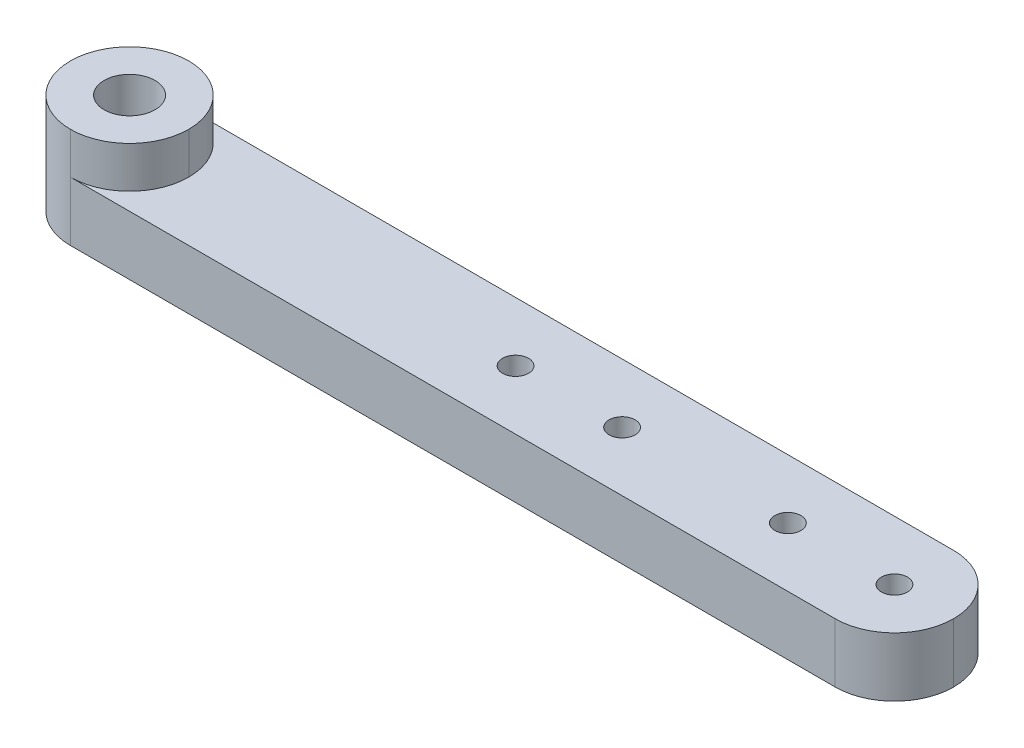
ISO-10303-21;
HEADER;
FILE_DESCRIPTION(('STEP AP214'),'2;1');
FILE_NAME('part.step','',(''),(''),'','','');
FILE_SCHEMA(('AUTOMOTIVE_DESIGN { 1 0 10303 214 1 1 1 1 }'));
ENDSEC;
DATA;
#1=APPLICATION_CONTEXT('core data for automotive mechanical design processes');
#2=APPLICATION_PROTOCOL_DEFINITION('international standard','automotive_design',2000,#1);
#3=PRODUCT_CONTEXT('',#1,'mechanical');
#4=PRODUCT('Part','Part','',(#3));
#5=PRODUCT_RELATED_PRODUCT_CATEGORY('part','',(#4));
#6=PRODUCT_DEFINITION_FORMATION('','',#4);
#7=PRODUCT_DEFINITION_CONTEXT('part definition',#1,'design');
#8=PRODUCT_DEFINITION('design','',#6,#7);
#9=PRODUCT_DEFINITION_SHAPE('','',#8);
#10=(LENGTH_UNIT() NAMED_UNIT(*) SI_UNIT(.MILLI.,.METRE.));
#11=(NAMED_UNIT(*) PLANE_ANGLE_UNIT() SI_UNIT($,.RADIAN.));
#12=(NAMED_UNIT(*) SI_UNIT($,.STERADIAN.) SOLID_ANGLE_UNIT());
#13=UNCERTAINTY_MEASURE_WITH_UNIT(LENGTH_MEASURE(1.E-05),#10,'distance_accuracy_value','');
#14=(GEOMETRIC_REPRESENTATION_CONTEXT(3) GLOBAL_UNCERTAINTY_ASSIGNED_CONTEXT((#13)) GLOBAL_UNIT_ASSIGNED_CONTEXT((#10,
#11,#12)) REPRESENTATION_CONTEXT('',''));
#15=CARTESIAN_POINT('',(0.,0.,0.));
#16=DIRECTION('',(0.,0.,1.));
#17=DIRECTION('',(1.,0.,0.));
#18=AXIS2_PLACEMENT_3D('',#15,#16,#17);
#19=CARTESIAN_POINT('',(-37.3,2.5,10.));
#20=DIRECTION('',(0.,-1.,0.));
#21=DIRECTION('',(0.,0.,-1.));
#22=AXIS2_PLACEMENT_3D('',#19,#20,#21);
#23=PLANE('',#22);
#24=CARTESIAN_POINT('',(32.3,2.5,5.));
#25=DIRECTION('',(0.,-1.,0.));
#26=DIRECTION('',(0.,0.,-1.));
#27=AXIS2_PLACEMENT_3D('',#24,#25,#26);
#28=CIRCLE('',#27,1.10000000000001);
#29=CARTESIAN_POINT('',(32.3,2.5,3.89999999999999));
#30=VERTEX_POINT('',#29);
#31=EDGE_CURVE('E135',#30,#30,#28,.T.);
#32=ORIENTED_EDGE('',*,*,#31,.T.);
#33=EDGE_LOOP('',(#32));
#34=FACE_BOUND('',#33,.T.);
#35=CARTESIAN_POINT('',(23.3,2.5,5.));
#36=DIRECTION('',(0.,-1.,0.));
#37=DIRECTION('',(0.,0.,-1.));
#38=AXIS2_PLACEMENT_3D('',#35,#36,#37);
#39=CIRCLE('',#38,1.1);
#40=CARTESIAN_POINT('',(23.3,2.5,3.9));
#41=VERTEX_POINT('',#40);
#42=EDGE_CURVE('E190',#41,#41,#39,.T.);
#43=ORIENTED_EDGE('',*,*,#42,.T.);
#44=EDGE_LOOP('',(#43));
#45=FACE_BOUND('',#44,.T.);
#46=CARTESIAN_POINT('',(9.30000000000001,2.5,5.));
#47=DIRECTION('',(0.,-1.,0.));
#48=DIRECTION('',(0.,0.,-1.));
#49=AXIS2_PLACEMENT_3D('',#46,#47,#48);
#50=CIRCLE('',#49,1.1);
#51=CARTESIAN_POINT('',(9.30000000000001,2.5,3.9));
#52=VERTEX_POINT('',#51);
#53=EDGE_CURVE('E194',#52,#52,#50,.T.);
#54=ORIENTED_EDGE('',*,*,#53,.T.);
#55=EDGE_LOOP('',(#54));
#56=FACE_BOUND('',#55,.T.);
#57=CARTESIAN_POINT('',(0.300000000000011,2.5,5.));
#58=DIRECTION('',(0.,-1.,0.));
#59=DIRECTION('',(0.,0.,-1.));
#60=AXIS2_PLACEMENT_3D('',#57,#58,#59);
#61=CIRCLE('',#60,1.1);
#62=CARTESIAN_POINT('',(0.300000000000011,2.5,3.9));
#63=VERTEX_POINT('',#62);
#64=EDGE_CURVE('E198',#63,#63,#61,.T.);
#65=ORIENTED_EDGE('',*,*,#64,.T.);
#66=EDGE_LOOP('',(#65));
#67=FACE_BOUND('',#66,.T.);
#68=DIRECTION('',(-1.,0.,0.));
#69=VECTOR('',#68,1.);
#70=CARTESIAN_POINT('',(-37.3,2.5,10.));
#71=LINE('',#70,#69);
#72=CARTESIAN_POINT('',(32.3,2.5,10.));
#73=VERTEX_POINT('',#72);
#74=CARTESIAN_POINT('',(-32.3,2.5,10.));
#75=VERTEX_POINT('',#74);
#76=EDGE_CURVE('E121',#73,#75,#71,.T.);
#77=ORIENTED_EDGE('',*,*,#76,.F.);
#78=CARTESIAN_POINT('',(32.3,2.5,5.));
#79=DIRECTION('',(0.,-1.,0.));
#80=DIRECTION('',(0.,0.,-1.));
#81=AXIS2_PLACEMENT_3D('',#78,#79,#80);
#82=CIRCLE('',#81,5.);
#83=CARTESIAN_POINT('',(37.3,2.5,5.));
#84=VERTEX_POINT('',#83);
#85=EDGE_CURVE('E108',#73,#84,#82,.F.);
#86=ORIENTED_EDGE('',*,*,#85,.T.);
#87=CARTESIAN_POINT('',(32.3,2.5,5.));
#88=DIRECTION('',(0.,-1.,0.));
#89=DIRECTION('',(0.,0.,-1.));
#90=AXIS2_PLACEMENT_3D('',#87,#88,#89);
#91=CIRCLE('',#90,5.);
#92=CARTESIAN_POINT('',(32.3,2.5,0.));
#93=VERTEX_POINT('',#92);
#94=EDGE_CURVE('E116',#84,#93,#91,.F.);
#95=ORIENTED_EDGE('',*,*,#94,.T.);
#96=DIRECTION('',(-1.,0.,0.));
#97=VECTOR('',#96,1.);
#98=CARTESIAN_POINT('',(-37.3,2.5,0.));
#99=LINE('',#98,#97);
#100=CARTESIAN_POINT('',(-32.3,2.5,0.));
#101=VERTEX_POINT('',#100);
#102=EDGE_CURVE('E132',#93,#101,#99,.T.);
#103=ORIENTED_EDGE('',*,*,#102,.T.);
#104=CARTESIAN_POINT('',(-32.3,2.5,5.));
#105=DIRECTION('',(0.,-1.,0.));
#106=DIRECTION('',(0.,0.,-1.));
#107=AXIS2_PLACEMENT_3D('',#104,#105,#106);
#108=CIRCLE('',#107,5.);
#109=CARTESIAN_POINT('',(-27.3,2.5,5.));
#110=VERTEX_POINT('',#109);
#111=EDGE_CURVE('E11',#101,#110,#108,.T.);
#112=ORIENTED_EDGE('',*,*,#111,.T.);
#113=CARTESIAN_POINT('',(-32.3,2.5,5.));
#114=DIRECTION('',(0.,-1.,0.));
#115=DIRECTION('',(0.,0.,-1.));
#116=AXIS2_PLACEMENT_3D('',#113,#114,#115);
#117=CIRCLE('',#116,5.);
#118=EDGE_CURVE('E50',#110,#75,#117,.T.);
#119=ORIENTED_EDGE('',*,*,#118,.T.);
#120=EDGE_LOOP('',(#77,#86,#95,#103,#112,#119));
#121=FACE_BOUND('',#120,.T.);
#122=ADVANCED_FACE('F41',(#34,#45,#56,#67,#121),#23,.F.);
#123=CARTESIAN_POINT('',(-37.3,-2.5,10.));
#124=DIRECTION('',(0.,1.,0.));
#125=DIRECTION('',(0.,0.,1.));
#126=AXIS2_PLACEMENT_3D('',#123,#124,#125);
#127=PLANE('',#126);
#128=CARTESIAN_POINT('',(-32.3,-2.5,5.));
#129=DIRECTION('',(0.,1.,0.));
#130=DIRECTION('',(0.,0.,1.));
#131=AXIS2_PLACEMENT_3D('',#128,#129,#130);
#132=CIRCLE('',#131,2.15);
#133=CARTESIAN_POINT('',(-32.3,-2.5,7.15));
#134=VERTEX_POINT('',#133);
#135=EDGE_CURVE('E203',#134,#134,#132,.T.);
#136=ORIENTED_EDGE('',*,*,#135,.T.);
#137=EDGE_LOOP('',(#136));
#138=FACE_BOUND('',#137,.T.);
#139=CARTESIAN_POINT('',(32.3,-2.5,5.));
#140=DIRECTION('',(0.,1.,0.));
#141=DIRECTION('',(0.,0.,1.));
#142=AXIS2_PLACEMENT_3D('',#139,#140,#141);
#143=CIRCLE('',#142,1.10000000000001);
#144=CARTESIAN_POINT('',(32.3,-2.5,6.10000000000001));
#145=VERTEX_POINT('',#144);
#146=EDGE_CURVE('E213',#145,#145,#143,.T.);
#147=ORIENTED_EDGE('',*,*,#146,.T.);
#148=EDGE_LOOP('',(#147));
#149=FACE_BOUND('',#148,.T.);
#150=CARTESIAN_POINT('',(23.3,-2.5,5.));
#151=DIRECTION('',(0.,1.,0.));
#152=DIRECTION('',(0.,0.,1.));
#153=AXIS2_PLACEMENT_3D('',#150,#151,#152);
#154=CIRCLE('',#153,1.1);
#155=CARTESIAN_POINT('',(23.3,-2.5,6.1));
#156=VERTEX_POINT('',#155);
#157=EDGE_CURVE('E210',#156,#156,#154,.T.);
#158=ORIENTED_EDGE('',*,*,#157,.T.);
#159=EDGE_LOOP('',(#158));
#160=FACE_BOUND('',#159,.T.);
#161=CARTESIAN_POINT('',(9.30000000000001,-2.5,5.));
#162=DIRECTION('',(0.,1.,0.));
#163=DIRECTION('',(0.,0.,1.));
#164=AXIS2_PLACEMENT_3D('',#161,#162,#163);
#165=CIRCLE('',#164,1.1);
#166=CARTESIAN_POINT('',(9.30000000000001,-2.5,6.1));
#167=VERTEX_POINT('',#166);
#168=EDGE_CURVE('E207',#167,#167,#165,.T.);
#169=ORIENTED_EDGE('',*,*,#168,.T.);
#170=EDGE_LOOP('',(#169));
#171=FACE_BOUND('',#170,.T.);
#172=CARTESIAN_POINT('',(0.300000000000011,-2.5,5.));
#173=DIRECTION('',(0.,1.,0.));
#174=DIRECTION('',(0.,0.,1.));
#175=AXIS2_PLACEMENT_3D('',#172,#173,#174);
#176=CIRCLE('',#175,1.1);
#177=CARTESIAN_POINT('',(0.300000000000011,-2.5,6.1));
#178=VERTEX_POINT('',#177);
#179=EDGE_CURVE('E204',#178,#178,#176,.T.);
#180=ORIENTED_EDGE('',*,*,#179,.T.);
#181=EDGE_LOOP('',(#180));
#182=FACE_BOUND('',#181,.T.);
#183=CARTESIAN_POINT('',(32.3,-2.5,5.));
#184=DIRECTION('',(0.,1.,0.));
#185=DIRECTION('',(0.,0.,1.));
#186=AXIS2_PLACEMENT_3D('',#183,#184,#185);
#187=CIRCLE('',#186,5.);
#188=CARTESIAN_POINT('',(32.3,-2.5,0.));
#189=VERTEX_POINT('',#188);
#190=CARTESIAN_POINT('',(37.3,-2.5,5.));
#191=VERTEX_POINT('',#190);
#192=EDGE_CURVE('E158',#189,#191,#187,.F.);
#193=ORIENTED_EDGE('',*,*,#192,.T.);
#194=CARTESIAN_POINT('',(32.3,-2.5,5.));
#195=DIRECTION('',(0.,1.,0.));
#196=DIRECTION('',(0.,0.,1.));
#197=AXIS2_PLACEMENT_3D('',#194,#195,#196);
#198=CIRCLE('',#197,5.);
#199=CARTESIAN_POINT('',(32.3,-2.5,10.));
#200=VERTEX_POINT('',#199);
#201=EDGE_CURVE('E160',#191,#200,#198,.F.);
#202=ORIENTED_EDGE('',*,*,#201,.T.);
#203=DIRECTION('',(1.,0.,0.));
#204=VECTOR('',#203,1.);
#205=CARTESIAN_POINT('',(-37.3,-2.5,10.));
#206=LINE('',#205,#204);
#207=CARTESIAN_POINT('',(-32.3,-2.5,10.));
#208=VERTEX_POINT('',#207);
#209=EDGE_CURVE('E123',#208,#200,#206,.T.);
#210=ORIENTED_EDGE('',*,*,#209,.F.);
#211=CARTESIAN_POINT('',(-32.3,-2.5,5.));
#212=DIRECTION('',(0.,1.,0.));
#213=DIRECTION('',(0.,0.,1.));
#214=AXIS2_PLACEMENT_3D('',#211,#212,#213);
#215=CIRCLE('',#214,5.);
#216=CARTESIAN_POINT('',(-37.3,-2.5,5.));
#217=VERTEX_POINT('',#216);
#218=EDGE_CURVE('E64',#208,#217,#215,.F.);
#219=ORIENTED_EDGE('',*,*,#218,.T.);
#220=CARTESIAN_POINT('',(-32.3,-2.5,5.));
#221=DIRECTION('',(0.,1.,0.));
#222=DIRECTION('',(0.,0.,1.));
#223=AXIS2_PLACEMENT_3D('',#220,#221,#222);
#224=CIRCLE('',#223,5.);
#225=CARTESIAN_POINT('',(-32.3,-2.5,0.));
#226=VERTEX_POINT('',#225);
#227=EDGE_CURVE('E156',#217,#226,#224,.F.);
#228=ORIENTED_EDGE('',*,*,#227,.T.);
#229=DIRECTION('',(1.,0.,0.));
#230=VECTOR('',#229,1.);
#231=CARTESIAN_POINT('',(-37.3,-2.5,0.));
#232=LINE('',#231,#230);
#233=EDGE_CURVE('E128',#226,#189,#232,.T.);
#234=ORIENTED_EDGE('',*,*,#233,.T.);
#235=EDGE_LOOP('',(#193,#202,#210,#219,#228,#234));
#236=FACE_BOUND('',#235,.T.);
#237=ADVANCED_FACE('F182',(#138,#149,#160,#171,#182,#236),#127,.F.);
#238=CARTESIAN_POINT('',(0.,0.,10.));
#239=DIRECTION('',(0.,0.,-1.));
#240=DIRECTION('',(-1.,0.,0.));
#241=AXIS2_PLACEMENT_3D('',#238,#239,#240);
#242=PLANE('',#241);
#243=ORIENTED_EDGE('',*,*,#209,.T.);
#244=DIRECTION('',(0.,1.,0.));
#245=VECTOR('',#244,1.);
#246=CARTESIAN_POINT('',(32.3,0.,10.));
#247=LINE('',#246,#245);
#248=EDGE_CURVE('E112',#200,#73,#247,.T.);
#249=ORIENTED_EDGE('',*,*,#248,.T.);
#250=ORIENTED_EDGE('',*,*,#76,.T.);
#251=DIRECTION('',(0.,-1.,0.));
#252=VECTOR('',#251,1.);
#253=CARTESIAN_POINT('',(-32.3,0.,10.));
#254=LINE('',#253,#252);
#255=EDGE_CURVE('E125',#75,#208,#254,.T.);
#256=ORIENTED_EDGE('',*,*,#255,.T.);
#257=EDGE_LOOP('',(#243,#249,#250,#256));
#258=FACE_BOUND('',#257,.T.);
#259=ADVANCED_FACE('F120',(#258),#242,.F.);
#260=CARTESIAN_POINT('',(0.,0.,0.));
#261=DIRECTION('',(0.,0.,-1.));
#262=DIRECTION('',(-1.,0.,0.));
#263=AXIS2_PLACEMENT_3D('',#260,#261,#262);
#264=PLANE('',#263);
#265=ORIENTED_EDGE('',*,*,#102,.F.);
#266=DIRECTION('',(0.,1.,0.));
#267=VECTOR('',#266,1.);
#268=CARTESIAN_POINT('',(32.3,-2.5,0.));
#269=LINE('',#268,#267);
#270=EDGE_CURVE('E152',#93,#189,#269,.F.);
#271=ORIENTED_EDGE('',*,*,#270,.T.);
#272=ORIENTED_EDGE('',*,*,#233,.F.);
#273=DIRECTION('',(0.,-1.,0.));
#274=VECTOR('',#273,1.);
#275=CARTESIAN_POINT('',(-32.3,6.,0.));
#276=LINE('',#275,#274);
#277=EDGE_CURVE('E149',#226,#101,#276,.F.);
#278=ORIENTED_EDGE('',*,*,#277,.T.);
#279=EDGE_LOOP('',(#265,#271,#272,#278));
#280=FACE_BOUND('',#279,.T.);
#281=ADVANCED_FACE('F186',(#280),#264,.T.);
#282=CARTESIAN_POINT('',(0.,6.,0.));
#283=DIRECTION('',(0.,-1.,0.));
#284=DIRECTION('',(0.,0.,-1.));
#285=AXIS2_PLACEMENT_3D('',#282,#283,#284);
#286=PLANE('',#285);
#287=CARTESIAN_POINT('',(-32.3,6.,5.));
#288=DIRECTION('',(0.,1.,0.));
#289=DIRECTION('',(0.,0.,1.));
#290=AXIS2_PLACEMENT_3D('',#287,#288,#289);
#291=CIRCLE('',#290,2.15);
#292=CARTESIAN_POINT('',(-32.3,6.,7.15));
#293=VERTEX_POINT('',#292);
#294=EDGE_CURVE('E216',#293,#293,#291,.T.);
#295=ORIENTED_EDGE('',*,*,#294,.F.);
#296=EDGE_LOOP('',(#295));
#297=FACE_BOUND('',#296,.T.);
#298=CARTESIAN_POINT('',(-32.3,6.,5.));
#299=DIRECTION('',(0.,-1.,0.));
#300=DIRECTION('',(0.,0.,-1.));
#301=AXIS2_PLACEMENT_3D('',#298,#299,#300);
#302=CIRCLE('',#301,5.);
#303=CARTESIAN_POINT('',(-37.3,6.,5.));
#304=VERTEX_POINT('',#303);
#305=CARTESIAN_POINT('',(-32.3,6.,10.));
#306=VERTEX_POINT('',#305);
#307=EDGE_CURVE('E124',#304,#306,#302,.F.);
#308=ORIENTED_EDGE('',*,*,#307,.T.);
#309=CARTESIAN_POINT('',(-32.3,6.,5.));
#310=DIRECTION('',(0.,-1.,0.));
#311=DIRECTION('',(0.,0.,-1.));
#312=AXIS2_PLACEMENT_3D('',#309,#310,#311);
#313=CIRCLE('',#312,5.);
#314=CARTESIAN_POINT('',(-27.3,6.,5.));
#315=VERTEX_POINT('',#314);
#316=EDGE_CURVE('E146',#306,#315,#313,.F.);
#317=ORIENTED_EDGE('',*,*,#316,.T.);
#318=CARTESIAN_POINT('',(-32.3,6.,5.));
#319=DIRECTION('',(0.,-1.,0.));
#320=DIRECTION('',(0.,0.,-1.));
#321=AXIS2_PLACEMENT_3D('',#318,#319,#320);
#322=CIRCLE('',#321,5.);
#323=CARTESIAN_POINT('',(-32.3,6.,0.));
#324=VERTEX_POINT('',#323);
#325=EDGE_CURVE('E144',#315,#324,#322,.F.);
#326=ORIENTED_EDGE('',*,*,#325,.T.);
#327=CARTESIAN_POINT('',(-32.3,6.,5.));
#328=DIRECTION('',(0.,-1.,0.));
#329=DIRECTION('',(0.,0.,-1.));
#330=AXIS2_PLACEMENT_3D('',#327,#328,#329);
#331=CIRCLE('',#330,5.);
#332=EDGE_CURVE('E142',#324,#304,#331,.F.);
#333=ORIENTED_EDGE('',*,*,#332,.T.);
#334=EDGE_LOOP('',(#308,#317,#326,#333));
#335=FACE_BOUND('',#334,.T.);
#336=ADVANCED_FACE('F231',(#297,#335),#286,.F.);
#337=CARTESIAN_POINT('',(-32.3,-2.5,5.));
#338=DIRECTION('',(0.,1.,0.));
#339=DIRECTION('',(0.,0.,1.));
#340=AXIS2_PLACEMENT_3D('',#337,#338,#339);
#341=CYLINDRICAL_SURFACE('',#340,5.);
#342=ORIENTED_EDGE('',*,*,#277,.F.);
#343=ORIENTED_EDGE('',*,*,#227,.F.);
#344=DIRECTION('',(0.,-1.,0.));
#345=VECTOR('',#344,1.);
#346=CARTESIAN_POINT('',(-37.3,-2.5,5.));
#347=LINE('',#346,#345);
#348=EDGE_CURVE('E138',#304,#217,#347,.T.);
#349=ORIENTED_EDGE('',*,*,#348,.F.);
#350=ORIENTED_EDGE('',*,*,#332,.F.);
#351=DIRECTION('',(0.,-1.,0.));
#352=VECTOR('',#351,1.);
#353=CARTESIAN_POINT('',(-32.3,6.,0.));
#354=LINE('',#353,#352);
#355=EDGE_CURVE('E167',#101,#324,#354,.F.);
#356=ORIENTED_EDGE('',*,*,#355,.F.);
#357=EDGE_LOOP('',(#342,#343,#349,#350,#356));
#358=FACE_BOUND('',#357,.T.);
#359=ADVANCED_FACE('F179',(#358),#341,.T.);
#360=CARTESIAN_POINT('',(-32.3,0.,5.));
#361=DIRECTION('',(0.,-1.,0.));
#362=DIRECTION('',(0.,0.,-1.));
#363=AXIS2_PLACEMENT_3D('',#360,#361,#362);
#364=CYLINDRICAL_SURFACE('',#363,5.);
#365=ORIENTED_EDGE('',*,*,#218,.F.);
#366=ORIENTED_EDGE('',*,*,#255,.F.);
#367=DIRECTION('',(0.,-1.,0.));
#368=VECTOR('',#367,1.);
#369=CARTESIAN_POINT('',(-32.3,0.,10.));
#370=LINE('',#369,#368);
#371=EDGE_CURVE('E165',#306,#75,#370,.T.);
#372=ORIENTED_EDGE('',*,*,#371,.F.);
#373=ORIENTED_EDGE('',*,*,#307,.F.);
#374=ORIENTED_EDGE('',*,*,#348,.T.);
#375=EDGE_LOOP('',(#365,#366,#372,#373,#374));
#376=FACE_BOUND('',#375,.T.);
#377=ADVANCED_FACE('F173',(#376),#364,.T.);
#378=CARTESIAN_POINT('',(-32.3,0.,5.));
#379=DIRECTION('',(0.,1.,0.));
#380=DIRECTION('',(0.,0.,1.));
#381=AXIS2_PLACEMENT_3D('',#378,#379,#380);
#382=CYLINDRICAL_SURFACE('',#381,5.);
#383=ORIENTED_EDGE('',*,*,#355,.T.);
#384=ORIENTED_EDGE('',*,*,#325,.F.);
#385=DIRECTION('',(0.,-1.,0.));
#386=VECTOR('',#385,1.);
#387=CARTESIAN_POINT('',(-27.3,6.,5.));
#388=LINE('',#387,#386);
#389=EDGE_CURVE('E163',#110,#315,#388,.F.);
#390=ORIENTED_EDGE('',*,*,#389,.F.);
#391=ORIENTED_EDGE('',*,*,#111,.F.);
#392=EDGE_LOOP('',(#383,#384,#390,#391));
#393=FACE_BOUND('',#392,.T.);
#394=ADVANCED_FACE('F240',(#393),#382,.T.);
#395=CARTESIAN_POINT('',(-32.3,6.,5.));
#396=DIRECTION('',(0.,-1.,0.));
#397=DIRECTION('',(0.,0.,-1.));
#398=AXIS2_PLACEMENT_3D('',#395,#396,#397);
#399=CYLINDRICAL_SURFACE('',#398,5.);
#400=ORIENTED_EDGE('',*,*,#316,.F.);
#401=ORIENTED_EDGE('',*,*,#371,.T.);
#402=ORIENTED_EDGE('',*,*,#118,.F.);
#403=ORIENTED_EDGE('',*,*,#389,.T.);
#404=EDGE_LOOP('',(#400,#401,#402,#403));
#405=FACE_BOUND('',#404,.T.);
#406=ADVANCED_FACE('F237',(#405),#399,.T.);
#407=CARTESIAN_POINT('',(32.3,-2.5,5.));
#408=DIRECTION('',(0.,-1.,0.));
#409=DIRECTION('',(0.,0.,-1.));
#410=AXIS2_PLACEMENT_3D('',#407,#408,#409);
#411=CYLINDRICAL_SURFACE('',#410,5.);
#412=DIRECTION('',(0.,1.,0.));
#413=VECTOR('',#412,1.);
#414=CARTESIAN_POINT('',(37.3,2.5,5.));
#415=LINE('',#414,#413);
#416=EDGE_CURVE('E45',#191,#84,#415,.T.);
#417=ORIENTED_EDGE('',*,*,#416,.F.);
#418=ORIENTED_EDGE('',*,*,#192,.F.);
#419=ORIENTED_EDGE('',*,*,#270,.F.);
#420=ORIENTED_EDGE('',*,*,#94,.F.);
#421=EDGE_LOOP('',(#417,#418,#419,#420));
#422=FACE_BOUND('',#421,.T.);
#423=ADVANCED_FACE('F43',(#422),#411,.T.);
#424=CARTESIAN_POINT('',(32.3,0.,5.));
#425=DIRECTION('',(0.,1.,0.));
#426=DIRECTION('',(0.,0.,1.));
#427=AXIS2_PLACEMENT_3D('',#424,#425,#426);
#428=CYLINDRICAL_SURFACE('',#427,5.);
#429=ORIENTED_EDGE('',*,*,#201,.F.);
#430=ORIENTED_EDGE('',*,*,#416,.T.);
#431=ORIENTED_EDGE('',*,*,#85,.F.);
#432=ORIENTED_EDGE('',*,*,#248,.F.);
#433=EDGE_LOOP('',(#429,#430,#431,#432));
#434=FACE_BOUND('',#433,.T.);
#435=ADVANCED_FACE('F111',(#434),#428,.T.);
#436=CARTESIAN_POINT('',(-32.3,-2.5,5.));
#437=DIRECTION('',(0.,1.,0.));
#438=DIRECTION('',(0.,0.,1.));
#439=AXIS2_PLACEMENT_3D('',#436,#437,#438);
#440=CYLINDRICAL_SURFACE('',#439,2.15);
#441=ORIENTED_EDGE('',*,*,#135,.F.);
#442=EDGE_LOOP('',(#441));
#443=FACE_BOUND('',#442,.T.);
#444=ORIENTED_EDGE('',*,*,#294,.T.);
#445=EDGE_LOOP('',(#444));
#446=FACE_BOUND('',#445,.T.);
#447=ADVANCED_FACE('F224',(#443,#446),#440,.F.);
#448=CARTESIAN_POINT('',(0.300000000000011,-2.5,5.));
#449=DIRECTION('',(0.,1.,0.));
#450=DIRECTION('',(0.,0.,1.));
#451=AXIS2_PLACEMENT_3D('',#448,#449,#450);
#452=CYLINDRICAL_SURFACE('',#451,1.1);
#453=ORIENTED_EDGE('',*,*,#179,.F.);
#454=EDGE_LOOP('',(#453));
#455=FACE_BOUND('',#454,.T.);
#456=ORIENTED_EDGE('',*,*,#64,.F.);
#457=EDGE_LOOP('',(#456));
#458=FACE_BOUND('',#457,.T.);
#459=ADVANCED_FACE('F227',(#455,#458),#452,.F.);
#460=CARTESIAN_POINT('',(9.30000000000001,-2.5,5.));
#461=DIRECTION('',(0.,1.,0.));
#462=DIRECTION('',(0.,0.,1.));
#463=AXIS2_PLACEMENT_3D('',#460,#461,#462);
#464=CYLINDRICAL_SURFACE('',#463,1.1);
#465=ORIENTED_EDGE('',*,*,#168,.F.);
#466=EDGE_LOOP('',(#465));
#467=FACE_BOUND('',#466,.T.);
#468=ORIENTED_EDGE('',*,*,#53,.F.);
#469=EDGE_LOOP('',(#468));
#470=FACE_BOUND('',#469,.T.);
#471=ADVANCED_FACE('F263',(#467,#470),#464,.F.);
#472=CARTESIAN_POINT('',(23.3,-2.5,5.));
#473=DIRECTION('',(0.,1.,0.));
#474=DIRECTION('',(0.,0.,1.));
#475=AXIS2_PLACEMENT_3D('',#472,#473,#474);
#476=CYLINDRICAL_SURFACE('',#475,1.1);
#477=ORIENTED_EDGE('',*,*,#157,.F.);
#478=EDGE_LOOP('',(#477));
#479=FACE_BOUND('',#478,.T.);
#480=ORIENTED_EDGE('',*,*,#42,.F.);
#481=EDGE_LOOP('',(#480));
#482=FACE_BOUND('',#481,.T.);
#483=ADVANCED_FACE('F267',(#479,#482),#476,.F.);
#484=CARTESIAN_POINT('',(32.3,-2.5,5.));
#485=DIRECTION('',(0.,1.,0.));
#486=DIRECTION('',(0.,0.,1.));
#487=AXIS2_PLACEMENT_3D('',#484,#485,#486);
#488=CYLINDRICAL_SURFACE('',#487,1.10000000000001);
#489=ORIENTED_EDGE('',*,*,#146,.F.);
#490=EDGE_LOOP('',(#489));
#491=FACE_BOUND('',#490,.T.);
#492=ORIENTED_EDGE('',*,*,#31,.F.);
#493=EDGE_LOOP('',(#492));
#494=FACE_BOUND('',#493,.T.);
#495=ADVANCED_FACE('F271',(#491,#494),#488,.F.);
#496=CLOSED_SHELL('',(#122,#237,#259,#281,#336,#359,#377,#394,#406,#423,#435,#447,#459,#471,
#483,#495));
#497=MANIFOLD_SOLID_BREP('B2',#496);
#498=ADVANCED_BREP_SHAPE_REPRESENTATION('',(#18,#497),#14);
#499=SHAPE_DEFINITION_REPRESENTATION(#9,#498);
ENDSEC;
END-ISO-10303-21;
